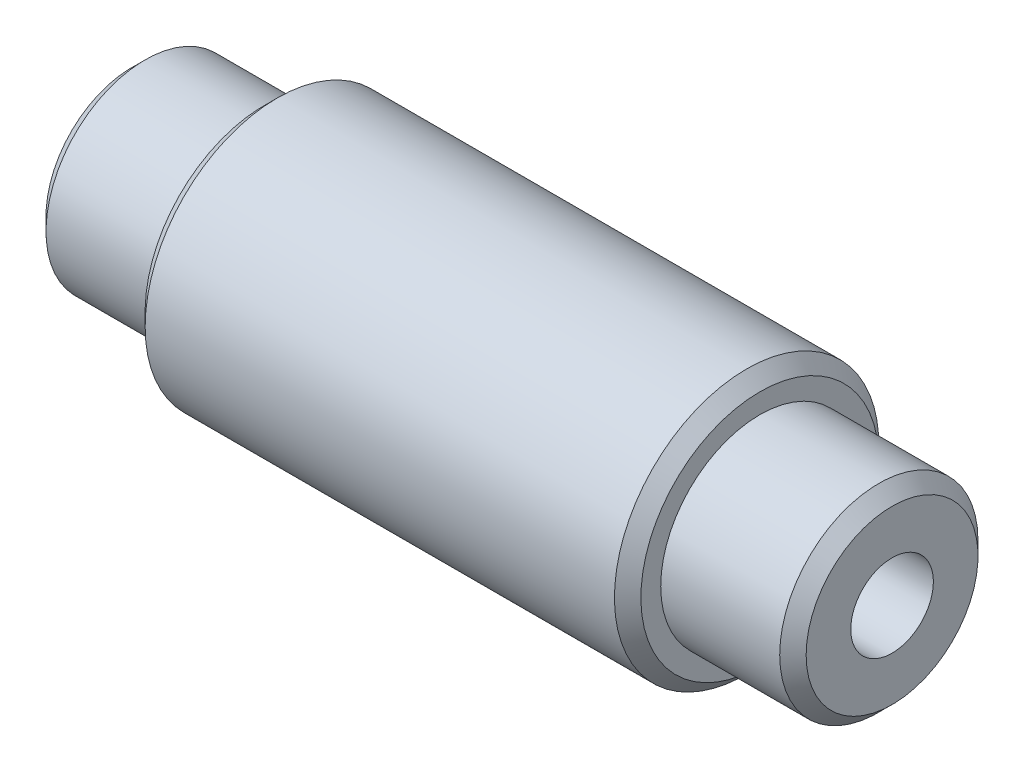
ISO-10303-21;
HEADER;
FILE_DESCRIPTION(('STEP AP214'),'2;1');
FILE_NAME('part.step','',(''),(''),'','','');
FILE_SCHEMA(('AUTOMOTIVE_DESIGN { 1 0 10303 214 1 1 1 1 }'));
ENDSEC;
DATA;
#1=APPLICATION_CONTEXT('core data for automotive mechanical design processes');
#2=APPLICATION_PROTOCOL_DEFINITION('international standard','automotive_design',2000,#1);
#3=PRODUCT_CONTEXT('',#1,'mechanical');
#4=PRODUCT('Part','Part','',(#3));
#5=PRODUCT_RELATED_PRODUCT_CATEGORY('part','',(#4));
#6=PRODUCT_DEFINITION_FORMATION('','',#4);
#7=PRODUCT_DEFINITION_CONTEXT('part definition',#1,'design');
#8=PRODUCT_DEFINITION('design','',#6,#7);
#9=PRODUCT_DEFINITION_SHAPE('','',#8);
#10=(LENGTH_UNIT() NAMED_UNIT(*) SI_UNIT(.MILLI.,.METRE.));
#11=(NAMED_UNIT(*) PLANE_ANGLE_UNIT() SI_UNIT($,.RADIAN.));
#12=(NAMED_UNIT(*) SI_UNIT($,.STERADIAN.) SOLID_ANGLE_UNIT());
#13=UNCERTAINTY_MEASURE_WITH_UNIT(LENGTH_MEASURE(1.E-05),#10,'distance_accuracy_value','');
#14=(GEOMETRIC_REPRESENTATION_CONTEXT(3) GLOBAL_UNCERTAINTY_ASSIGNED_CONTEXT((#13)) GLOBAL_UNIT_ASSIGNED_CONTEXT((#10,
#11,#12)) REPRESENTATION_CONTEXT('',''));
#15=CARTESIAN_POINT('',(0.,0.,0.));
#16=DIRECTION('',(0.,0.,1.));
#17=DIRECTION('',(1.,0.,0.));
#18=AXIS2_PLACEMENT_3D('',#15,#16,#17);
#19=CARTESIAN_POINT('',(0.,0.,0.));
#20=DIRECTION('',(-1.,0.,0.));
#21=DIRECTION('',(0.,-1.,0.));
#22=AXIS2_PLACEMENT_3D('',#19,#20,#21);
#23=PLANE('',#22);
#24=CARTESIAN_POINT('',(0.,0.,0.));
#25=DIRECTION('',(-1.,0.,0.));
#26=DIRECTION('',(0.,-1.,0.));
#27=AXIS2_PLACEMENT_3D('',#24,#25,#26);
#28=CIRCLE('',#27,3.6);
#29=CARTESIAN_POINT('',(0.,-3.60000000000001,0.));
#30=VERTEX_POINT('',#29);
#31=EDGE_CURVE('E88',#30,#30,#28,.T.);
#32=ORIENTED_EDGE('',*,*,#31,.T.);
#33=EDGE_LOOP('',(#32));
#34=FACE_BOUND('',#33,.T.);
#35=CARTESIAN_POINT('',(0.,0.,0.));
#36=DIRECTION('',(-1.,0.,0.));
#37=DIRECTION('',(0.,-1.,0.));
#38=AXIS2_PLACEMENT_3D('',#35,#36,#37);
#39=CIRCLE('',#38,3.);
#40=CARTESIAN_POINT('',(0.,-3.,0.));
#41=VERTEX_POINT('',#40);
#42=EDGE_CURVE('E79',#41,#41,#39,.F.);
#43=ORIENTED_EDGE('',*,*,#42,.T.);
#44=EDGE_LOOP('',(#43));
#45=FACE_BOUND('',#44,.T.);
#46=ADVANCED_FACE('F43',(#34,#45),#23,.T.);
#47=CARTESIAN_POINT('',(15.,4.,0.));
#48=DIRECTION('',(1.,0.,0.));
#49=DIRECTION('',(0.,1.,0.));
#50=AXIS2_PLACEMENT_3D('',#47,#48,#49);
#51=PLANE('',#50);
#52=CARTESIAN_POINT('',(15.,0.,0.));
#53=DIRECTION('',(1.,0.,0.));
#54=DIRECTION('',(0.,1.,0.));
#55=AXIS2_PLACEMENT_3D('',#52,#53,#54);
#56=CIRCLE('',#55,3.6);
#57=CARTESIAN_POINT('',(15.,3.6,0.));
#58=VERTEX_POINT('',#57);
#59=EDGE_CURVE('E91',#58,#58,#56,.T.);
#60=ORIENTED_EDGE('',*,*,#59,.T.);
#61=EDGE_LOOP('',(#60));
#62=FACE_BOUND('',#61,.T.);
#63=CARTESIAN_POINT('',(15.,0.,0.));
#64=DIRECTION('',(1.,0.,0.));
#65=DIRECTION('',(0.,1.,0.));
#66=AXIS2_PLACEMENT_3D('',#63,#64,#65);
#67=CIRCLE('',#66,3.);
#68=CARTESIAN_POINT('',(15.,3.,0.));
#69=VERTEX_POINT('',#68);
#70=EDGE_CURVE('E78',#69,#69,#67,.F.);
#71=ORIENTED_EDGE('',*,*,#70,.T.);
#72=EDGE_LOOP('',(#71));
#73=FACE_BOUND('',#72,.T.);
#74=ADVANCED_FACE('F116',(#62,#73),#51,.T.);
#75=CARTESIAN_POINT('',(15.,0.,0.));
#76=DIRECTION('',(1.,0.,0.));
#77=DIRECTION('',(0.,1.,0.));
#78=AXIS2_PLACEMENT_3D('',#75,#76,#77);
#79=CYLINDRICAL_SURFACE('',#78,4.);
#80=CARTESIAN_POINT('',(0.399999999999992,0.,0.));
#81=DIRECTION('',(-1.,0.,0.));
#82=DIRECTION('',(0.,-1.,0.));
#83=AXIS2_PLACEMENT_3D('',#80,#81,#82);
#84=CIRCLE('',#83,4.);
#85=CARTESIAN_POINT('',(0.399999999999993,-4.,0.));
#86=VERTEX_POINT('',#85);
#87=EDGE_CURVE('E85',#86,#86,#84,.F.);
#88=ORIENTED_EDGE('',*,*,#87,.T.);
#89=EDGE_LOOP('',(#88));
#90=FACE_BOUND('',#89,.T.);
#91=CARTESIAN_POINT('',(14.6,0.,0.));
#92=DIRECTION('',(1.,0.,0.));
#93=DIRECTION('',(0.,1.,0.));
#94=AXIS2_PLACEMENT_3D('',#91,#92,#93);
#95=CIRCLE('',#94,4.);
#96=CARTESIAN_POINT('',(14.6,4.,0.));
#97=VERTEX_POINT('',#96);
#98=EDGE_CURVE('E82',#97,#97,#95,.F.);
#99=ORIENTED_EDGE('',*,*,#98,.T.);
#100=EDGE_LOOP('',(#99));
#101=FACE_BOUND('',#100,.T.);
#102=ADVANCED_FACE('F122',(#90,#101),#79,.T.);
#103=CARTESIAN_POINT('',(0.399999999999992,0.,0.));
#104=DIRECTION('',(1.,0.,0.));
#105=DIRECTION('',(0.,1.,0.));
#106=AXIS2_PLACEMENT_3D('',#103,#104,#105);
#107=CONICAL_SURFACE('',#106,4.,0.785398163397452);
#108=ORIENTED_EDGE('',*,*,#31,.F.);
#109=EDGE_LOOP('',(#108));
#110=FACE_BOUND('',#109,.T.);
#111=ORIENTED_EDGE('',*,*,#87,.F.);
#112=EDGE_LOOP('',(#111));
#113=FACE_BOUND('',#112,.T.);
#114=ADVANCED_FACE('F128',(#110,#113),#107,.T.);
#115=CARTESIAN_POINT('',(15.,0.,0.));
#116=DIRECTION('',(-1.,0.,0.));
#117=DIRECTION('',(0.,-1.,0.));
#118=AXIS2_PLACEMENT_3D('',#115,#116,#117);
#119=CONICAL_SURFACE('',#118,3.6,0.785398163397445);
#120=ORIENTED_EDGE('',*,*,#98,.F.);
#121=EDGE_LOOP('',(#120));
#122=FACE_BOUND('',#121,.T.);
#123=ORIENTED_EDGE('',*,*,#59,.F.);
#124=EDGE_LOOP('',(#123));
#125=FACE_BOUND('',#124,.T.);
#126=ADVANCED_FACE('F131',(#122,#125),#119,.T.);
#127=CARTESIAN_POINT('',(19.,3.,0.));
#128=DIRECTION('',(-1.,0.,0.));
#129=DIRECTION('',(0.,0.,1.));
#130=AXIS2_PLACEMENT_3D('',#127,#128,#129);
#131=PLANE('',#130);
#132=CARTESIAN_POINT('',(19.,0.,0.));
#133=DIRECTION('',(-1.,0.,0.));
#134=DIRECTION('',(0.,0.,1.));
#135=AXIS2_PLACEMENT_3D('',#132,#133,#134);
#136=CIRCLE('',#135,2.6);
#137=CARTESIAN_POINT('',(19.,0.,2.6));
#138=VERTEX_POINT('',#137);
#139=EDGE_CURVE('E11',#138,#138,#136,.F.);
#140=ORIENTED_EDGE('',*,*,#139,.T.);
#141=EDGE_LOOP('',(#140));
#142=FACE_BOUND('',#141,.T.);
#143=CARTESIAN_POINT('',(19.,0.,0.));
#144=DIRECTION('',(1.,0.,0.));
#145=DIRECTION('',(0.,0.,-1.));
#146=AXIS2_PLACEMENT_3D('',#143,#144,#145);
#147=CIRCLE('',#146,1.25);
#148=CARTESIAN_POINT('',(19.,0.,-1.25));
#149=VERTEX_POINT('',#148);
#150=EDGE_CURVE('E68',#149,#149,#147,.T.);
#151=ORIENTED_EDGE('',*,*,#150,.F.);
#152=EDGE_LOOP('',(#151));
#153=FACE_BOUND('',#152,.T.);
#154=ADVANCED_FACE('F134',(#142,#153),#131,.F.);
#155=CARTESIAN_POINT('',(-4.,0.,0.));
#156=DIRECTION('',(-1.,0.,0.));
#157=DIRECTION('',(0.,0.,1.));
#158=AXIS2_PLACEMENT_3D('',#155,#156,#157);
#159=CYLINDRICAL_SURFACE('',#158,3.);
#160=CARTESIAN_POINT('',(18.6,0.,0.));
#161=DIRECTION('',(-1.,0.,0.));
#162=DIRECTION('',(0.,0.,1.));
#163=AXIS2_PLACEMENT_3D('',#160,#161,#162);
#164=CIRCLE('',#163,3.);
#165=CARTESIAN_POINT('',(18.6,0.,3.));
#166=VERTEX_POINT('',#165);
#167=EDGE_CURVE('E51',#166,#166,#164,.T.);
#168=ORIENTED_EDGE('',*,*,#167,.T.);
#169=EDGE_LOOP('',(#168));
#170=FACE_BOUND('',#169,.T.);
#171=ORIENTED_EDGE('',*,*,#70,.F.);
#172=EDGE_LOOP('',(#171));
#173=FACE_BOUND('',#172,.T.);
#174=ADVANCED_FACE('F104',(#170,#173),#159,.T.);
#175=CARTESIAN_POINT('',(-3.6,0.,0.));
#176=DIRECTION('',(1.,0.,0.));
#177=DIRECTION('',(0.,0.,-1.));
#178=AXIS2_PLACEMENT_3D('',#175,#176,#177);
#179=CIRCLE('',#178,3.);
#180=CARTESIAN_POINT('',(-3.6,0.,-3.));
#181=VERTEX_POINT('',#180);
#182=EDGE_CURVE('E99',#181,#181,#179,.T.);
#183=ORIENTED_EDGE('',*,*,#182,.T.);
#184=EDGE_LOOP('',(#183));
#185=FACE_BOUND('',#184,.T.);
#186=ORIENTED_EDGE('',*,*,#42,.F.);
#187=EDGE_LOOP('',(#186));
#188=FACE_BOUND('',#187,.T.);
#189=ADVANCED_FACE('F147',(#185,#188),#159,.T.);
#190=CARTESIAN_POINT('',(-4.,0.,0.));
#191=DIRECTION('',(1.,0.,0.));
#192=DIRECTION('',(0.,0.,-1.));
#193=AXIS2_PLACEMENT_3D('',#190,#191,#192);
#194=PLANE('',#193);
#195=CARTESIAN_POINT('',(-4.,0.,0.));
#196=DIRECTION('',(1.,0.,0.));
#197=DIRECTION('',(0.,0.,-1.));
#198=AXIS2_PLACEMENT_3D('',#195,#196,#197);
#199=CIRCLE('',#198,2.6);
#200=CARTESIAN_POINT('',(-4.,0.,-2.6));
#201=VERTEX_POINT('',#200);
#202=EDGE_CURVE('E94',#201,#201,#199,.F.);
#203=ORIENTED_EDGE('',*,*,#202,.T.);
#204=EDGE_LOOP('',(#203));
#205=FACE_BOUND('',#204,.T.);
#206=CARTESIAN_POINT('',(-4.,0.,0.));
#207=DIRECTION('',(-1.,0.,0.));
#208=DIRECTION('',(0.,0.,1.));
#209=AXIS2_PLACEMENT_3D('',#206,#207,#208);
#210=CIRCLE('',#209,1.25);
#211=CARTESIAN_POINT('',(-4.,0.,1.25));
#212=VERTEX_POINT('',#211);
#213=EDGE_CURVE('E67',#212,#212,#210,.T.);
#214=ORIENTED_EDGE('',*,*,#213,.F.);
#215=EDGE_LOOP('',(#214));
#216=FACE_BOUND('',#215,.T.);
#217=ADVANCED_FACE('F152',(#205,#216),#194,.F.);
#218=CARTESIAN_POINT('',(4.5,0.,0.));
#219=DIRECTION('',(-1.,0.,0.));
#220=DIRECTION('',(0.,0.,1.));
#221=AXIS2_PLACEMENT_3D('',#218,#219,#220);
#222=CONICAL_SURFACE('',#221,1.25,1.02974425867666);
#223=CARTESIAN_POINT('',(5.25107577378445,0.,0.));
#224=VERTEX_POINT('',#223);
#225=VERTEX_LOOP('',#224);
#226=FACE_BOUND('',#225,.T.);
#227=CARTESIAN_POINT('',(4.5,0.,0.));
#228=DIRECTION('',(-1.,0.,0.));
#229=DIRECTION('',(0.,0.,1.));
#230=AXIS2_PLACEMENT_3D('',#227,#228,#229);
#231=CIRCLE('',#230,1.25);
#232=CARTESIAN_POINT('',(4.5,0.,1.25));
#233=VERTEX_POINT('',#232);
#234=EDGE_CURVE('E71',#233,#233,#231,.T.);
#235=ORIENTED_EDGE('',*,*,#234,.T.);
#236=EDGE_LOOP('',(#235));
#237=FACE_BOUND('',#236,.T.);
#238=ADVANCED_FACE('F157',(#226,#237),#222,.F.);
#239=CARTESIAN_POINT('',(-4.,0.,0.));
#240=DIRECTION('',(-1.,0.,0.));
#241=DIRECTION('',(0.,0.,1.));
#242=AXIS2_PLACEMENT_3D('',#239,#240,#241);
#243=CYLINDRICAL_SURFACE('',#242,1.25);
#244=ORIENTED_EDGE('',*,*,#234,.F.);
#245=EDGE_LOOP('',(#244));
#246=FACE_BOUND('',#245,.T.);
#247=ORIENTED_EDGE('',*,*,#213,.T.);
#248=EDGE_LOOP('',(#247));
#249=FACE_BOUND('',#248,.T.);
#250=ADVANCED_FACE('F61',(#246,#249),#243,.F.);
#251=CARTESIAN_POINT('',(10.5,0.,0.));
#252=DIRECTION('',(1.,0.,0.));
#253=DIRECTION('',(0.,0.,-1.));
#254=AXIS2_PLACEMENT_3D('',#251,#252,#253);
#255=CONICAL_SURFACE('',#254,1.25,1.02974425867666);
#256=CARTESIAN_POINT('',(9.74892422621555,0.,0.));
#257=VERTEX_POINT('',#256);
#258=VERTEX_LOOP('',#257);
#259=FACE_BOUND('',#258,.T.);
#260=CARTESIAN_POINT('',(10.5,0.,0.));
#261=DIRECTION('',(1.,0.,0.));
#262=DIRECTION('',(0.,0.,-1.));
#263=AXIS2_PLACEMENT_3D('',#260,#261,#262);
#264=CIRCLE('',#263,1.25);
#265=CARTESIAN_POINT('',(10.5,0.,-1.25));
#266=VERTEX_POINT('',#265);
#267=EDGE_CURVE('E65',#266,#266,#264,.T.);
#268=ORIENTED_EDGE('',*,*,#267,.T.);
#269=EDGE_LOOP('',(#268));
#270=FACE_BOUND('',#269,.T.);
#271=ADVANCED_FACE('F57',(#259,#270),#255,.F.);
#272=CARTESIAN_POINT('',(19.,0.,0.));
#273=DIRECTION('',(1.,0.,0.));
#274=DIRECTION('',(0.,0.,-1.));
#275=AXIS2_PLACEMENT_3D('',#272,#273,#274);
#276=CYLINDRICAL_SURFACE('',#275,1.25);
#277=ORIENTED_EDGE('',*,*,#267,.F.);
#278=EDGE_LOOP('',(#277));
#279=FACE_BOUND('',#278,.T.);
#280=ORIENTED_EDGE('',*,*,#150,.T.);
#281=EDGE_LOOP('',(#280));
#282=FACE_BOUND('',#281,.T.);
#283=ADVANCED_FACE('F60',(#279,#282),#276,.F.);
#284=CARTESIAN_POINT('',(-4.,0.,0.));
#285=DIRECTION('',(1.,0.,0.));
#286=DIRECTION('',(0.,0.,-1.));
#287=AXIS2_PLACEMENT_3D('',#284,#285,#286);
#288=CONICAL_SURFACE('',#287,2.6,0.785398163397449);
#289=ORIENTED_EDGE('',*,*,#182,.F.);
#290=EDGE_LOOP('',(#289));
#291=FACE_BOUND('',#290,.T.);
#292=ORIENTED_EDGE('',*,*,#202,.F.);
#293=EDGE_LOOP('',(#292));
#294=FACE_BOUND('',#293,.T.);
#295=ADVANCED_FACE('F108',(#291,#294),#288,.T.);
#296=CARTESIAN_POINT('',(18.6,0.,0.));
#297=DIRECTION('',(-1.,0.,0.));
#298=DIRECTION('',(0.,0.,1.));
#299=AXIS2_PLACEMENT_3D('',#296,#297,#298);
#300=CONICAL_SURFACE('',#299,3.,0.785398163397448);
#301=ORIENTED_EDGE('',*,*,#139,.F.);
#302=EDGE_LOOP('',(#301));
#303=FACE_BOUND('',#302,.T.);
#304=ORIENTED_EDGE('',*,*,#167,.F.);
#305=EDGE_LOOP('',(#304));
#306=FACE_BOUND('',#305,.T.);
#307=ADVANCED_FACE('F45',(#303,#306),#300,.T.);
#308=CLOSED_SHELL('',(#46,#74,#102,#114,#126,#154,#174,#189,#217,#238,#250,#271,#283,#295,#307));
#309=MANIFOLD_SOLID_BREP('B2',#308);
#310=ADVANCED_BREP_SHAPE_REPRESENTATION('',(#18,#309),#14);
#311=SHAPE_DEFINITION_REPRESENTATION(#9,#310);
ENDSEC;
END-ISO-10303-21;
